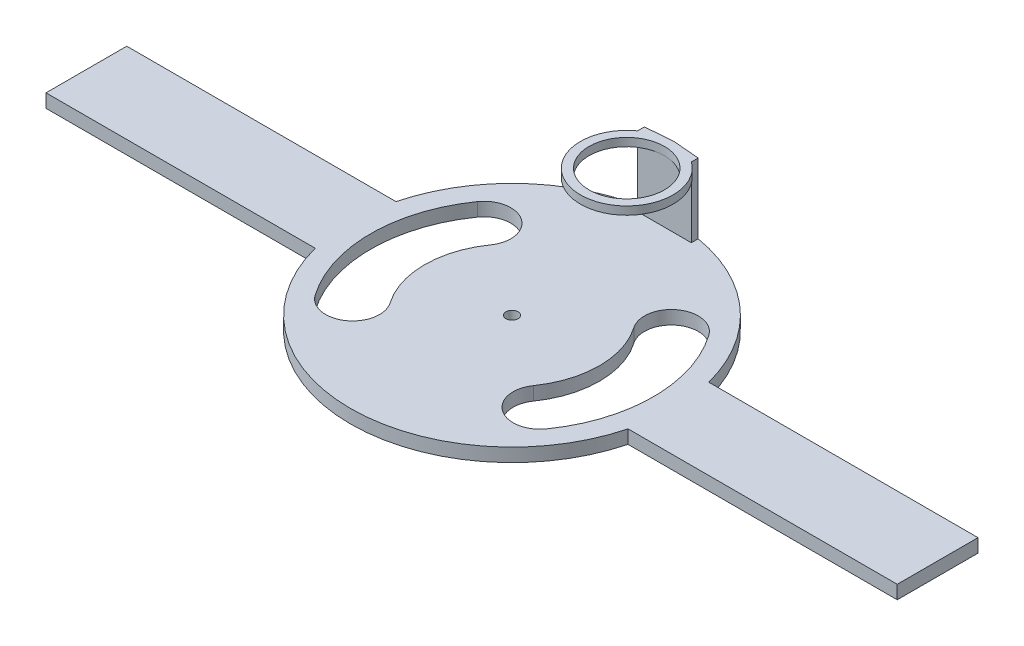
ISO-10303-21;
HEADER;
FILE_DESCRIPTION(('STEP AP214'),'2;1');
FILE_NAME('part.step','',(''),(''),'','','');
FILE_SCHEMA(('AUTOMOTIVE_DESIGN { 1 0 10303 214 1 1 1 1 }'));
ENDSEC;
DATA;
#1=APPLICATION_CONTEXT('core data for automotive mechanical design processes');
#2=APPLICATION_PROTOCOL_DEFINITION('international standard','automotive_design',2000,#1);
#3=PRODUCT_CONTEXT('',#1,'mechanical');
#4=PRODUCT('Part','Part','',(#3));
#5=PRODUCT_RELATED_PRODUCT_CATEGORY('part','',(#4));
#6=PRODUCT_DEFINITION_FORMATION('','',#4);
#7=PRODUCT_DEFINITION_CONTEXT('part definition',#1,'design');
#8=PRODUCT_DEFINITION('design','',#6,#7);
#9=PRODUCT_DEFINITION_SHAPE('','',#8);
#10=(LENGTH_UNIT() NAMED_UNIT(*) SI_UNIT(.MILLI.,.METRE.));
#11=(NAMED_UNIT(*) PLANE_ANGLE_UNIT() SI_UNIT($,.RADIAN.));
#12=(NAMED_UNIT(*) SI_UNIT($,.STERADIAN.) SOLID_ANGLE_UNIT());
#13=UNCERTAINTY_MEASURE_WITH_UNIT(LENGTH_MEASURE(1.E-05),#10,'distance_accuracy_value','');
#14=(GEOMETRIC_REPRESENTATION_CONTEXT(3) GLOBAL_UNCERTAINTY_ASSIGNED_CONTEXT((#13)) GLOBAL_UNIT_ASSIGNED_CONTEXT((#10,
#11,#12)) REPRESENTATION_CONTEXT('',''));
#15=CARTESIAN_POINT('',(0.,0.,0.));
#16=DIRECTION('',(0.,0.,1.));
#17=DIRECTION('',(1.,0.,0.));
#18=AXIS2_PLACEMENT_3D('',#15,#16,#17);
#19=CARTESIAN_POINT('',(0.,28.,0.));
#20=DIRECTION('',(0.,1.,0.));
#21=DIRECTION('',(0.,0.,1.));
#22=AXIS2_PLACEMENT_3D('',#19,#20,#21);
#23=PLANE('',#22);
#24=CARTESIAN_POINT('',(0.,28.,0.));
#25=DIRECTION('',(0.,1.,0.));
#26=DIRECTION('',(0.,0.,1.));
#27=AXIS2_PLACEMENT_3D('',#24,#25,#26);
#28=CIRCLE('',#27,60.);
#29=CARTESIAN_POINT('',(-1.15359111152458E-13,28.,-60.));
#30=VERTEX_POINT('',#29);
#31=CARTESIAN_POINT('',(-10.,28.,-59.1607978309962));
#32=VERTEX_POINT('',#31);
#33=EDGE_CURVE('E291',#30,#32,#28,.T.);
#34=ORIENTED_EDGE('',*,*,#33,.T.);
#35=DIRECTION('',(0.99649718945496,0.,-0.0836262602796829));
#36=VECTOR('',#35,1.);
#37=CARTESIAN_POINT('',(-4.99999999999998,28.,-59.5803989154981));
#38=LINE('',#37,#36);
#39=EDGE_CURVE('E409',#32,#30,#38,.T.);
#40=ORIENTED_EDGE('',*,*,#39,.T.);
#41=EDGE_LOOP('',(#34,#40));
#42=FACE_BOUND('',#41,.T.);
#43=ADVANCED_FACE('F45',(#42),#23,.T.);
#44=CARTESIAN_POINT('',(10.,28.,-59.1607978309962));
#45=VERTEX_POINT('',#44);
#46=EDGE_CURVE('E293',#45,#30,#28,.T.);
#47=ORIENTED_EDGE('',*,*,#46,.T.);
#48=DIRECTION('',(0.99649718945496,0.,0.0836262602796836));
#49=VECTOR('',#48,1.);
#50=CARTESIAN_POINT('',(5.00000000000002,28.,-59.5803989154981));
#51=LINE('',#50,#49);
#52=EDGE_CURVE('E414',#30,#45,#51,.T.);
#53=ORIENTED_EDGE('',*,*,#52,.T.);
#54=EDGE_LOOP('',(#47,#53));
#55=FACE_BOUND('',#54,.T.);
#56=ADVANCED_FACE('F419',(#55),#23,.T.);
#57=CARTESIAN_POINT('',(0.,5.,0.));
#58=DIRECTION('',(0.,-1.,0.));
#59=DIRECTION('',(0.,0.,-1.));
#60=AXIS2_PLACEMENT_3D('',#57,#58,#59);
#61=CYLINDRICAL_SURFACE('',#60,60.);
#62=DIRECTION('',(0.,1.,0.));
#63=VECTOR('',#62,1.);
#64=CARTESIAN_POINT('',(58.0947501931113,0.,-15.));
#65=LINE('',#64,#63);
#66=CARTESIAN_POINT('',(58.0947501931113,0.,-15.));
#67=VERTEX_POINT('',#66);
#68=CARTESIAN_POINT('',(58.0947501931113,5.,-15.));
#69=VERTEX_POINT('',#68);
#70=EDGE_CURVE('E63',#67,#69,#65,.T.);
#71=ORIENTED_EDGE('',*,*,#70,.F.);
#72=CARTESIAN_POINT('',(0.,0.,0.));
#73=DIRECTION('',(0.,1.,0.));
#74=DIRECTION('',(0.,0.,1.));
#75=AXIS2_PLACEMENT_3D('',#72,#73,#74);
#76=CIRCLE('',#75,60.);
#77=CARTESIAN_POINT('',(-58.0947501931113,0.,-15.));
#78=VERTEX_POINT('',#77);
#79=EDGE_CURVE('E342',#67,#78,#76,.T.);
#80=ORIENTED_EDGE('',*,*,#79,.T.);
#81=DIRECTION('',(0.,1.,0.));
#82=VECTOR('',#81,1.);
#83=CARTESIAN_POINT('',(-58.0947501931113,0.,-15.));
#84=LINE('',#83,#82);
#85=CARTESIAN_POINT('',(-58.0947501931113,5.,-15.));
#86=VERTEX_POINT('',#85);
#87=EDGE_CURVE('E272',#78,#86,#84,.T.);
#88=ORIENTED_EDGE('',*,*,#87,.T.);
#89=CARTESIAN_POINT('',(0.,5.,0.));
#90=DIRECTION('',(0.,1.,0.));
#91=DIRECTION('',(0.,0.,1.));
#92=AXIS2_PLACEMENT_3D('',#89,#90,#91);
#93=CIRCLE('',#92,60.);
#94=CARTESIAN_POINT('',(-10.,5.,-59.1607978309962));
#95=VERTEX_POINT('',#94);
#96=EDGE_CURVE('E11',#95,#86,#93,.T.);
#97=ORIENTED_EDGE('',*,*,#96,.F.);
#98=DIRECTION('',(0.,-1.,0.));
#99=VECTOR('',#98,1.);
#100=CARTESIAN_POINT('',(-10.,28.,-59.1607978309962));
#101=LINE('',#100,#99);
#102=EDGE_CURVE('E305',#32,#95,#101,.T.);
#103=ORIENTED_EDGE('',*,*,#102,.F.);
#104=ORIENTED_EDGE('',*,*,#33,.F.);
#105=ORIENTED_EDGE('',*,*,#46,.F.);
#106=DIRECTION('',(0.,-1.,0.));
#107=VECTOR('',#106,1.);
#108=CARTESIAN_POINT('',(10.,28.,-59.1607978309962));
#109=LINE('',#108,#107);
#110=CARTESIAN_POINT('',(10.,5.,-59.1607978309962));
#111=VERTEX_POINT('',#110);
#112=EDGE_CURVE('E308',#45,#111,#109,.T.);
#113=ORIENTED_EDGE('',*,*,#112,.T.);
#114=EDGE_CURVE('E56',#69,#111,#93,.T.);
#115=ORIENTED_EDGE('',*,*,#114,.F.);
#116=EDGE_LOOP('',(#71,#80,#88,#97,#103,#104,#105,#113,#115));
#117=FACE_BOUND('',#116,.T.);
#118=ADVANCED_FACE('F47',(#117),#61,.T.);
#119=DIRECTION('',(0.,1.,0.));
#120=VECTOR('',#119,1.);
#121=CARTESIAN_POINT('',(58.0947501931112,0.,15.));
#122=LINE('',#121,#120);
#123=CARTESIAN_POINT('',(58.0947501931112,0.,15.));
#124=VERTEX_POINT('',#123);
#125=CARTESIAN_POINT('',(58.0947501931112,5.,15.));
#126=VERTEX_POINT('',#125);
#127=EDGE_CURVE('E250',#124,#126,#122,.T.);
#128=ORIENTED_EDGE('',*,*,#127,.T.);
#129=CARTESIAN_POINT('',(-58.0947501931113,5.,15.));
#130=VERTEX_POINT('',#129);
#131=EDGE_CURVE('E54',#130,#126,#93,.T.);
#132=ORIENTED_EDGE('',*,*,#131,.F.);
#133=DIRECTION('',(0.,1.,0.));
#134=VECTOR('',#133,1.);
#135=CARTESIAN_POINT('',(-58.0947501931112,0.,15.));
#136=LINE('',#135,#134);
#137=CARTESIAN_POINT('',(-58.0947501931112,0.,15.));
#138=VERTEX_POINT('',#137);
#139=EDGE_CURVE('E278',#138,#130,#136,.T.);
#140=ORIENTED_EDGE('',*,*,#139,.F.);
#141=EDGE_CURVE('E378',#138,#124,#76,.T.);
#142=ORIENTED_EDGE('',*,*,#141,.T.);
#143=EDGE_LOOP('',(#128,#132,#140,#142));
#144=FACE_BOUND('',#143,.T.);
#145=ADVANCED_FACE('F441',(#144),#61,.T.);
#146=CARTESIAN_POINT('',(0.,5.,0.));
#147=DIRECTION('',(0.,1.,0.));
#148=DIRECTION('',(0.,0.,1.));
#149=AXIS2_PLACEMENT_3D('',#146,#147,#148);
#150=PLANE('',#149);
#151=CARTESIAN_POINT('',(0.,5.,0.));
#152=DIRECTION('',(0.,1.,0.));
#153=DIRECTION('',(0.,0.,1.));
#154=AXIS2_PLACEMENT_3D('',#151,#152,#153);
#155=CIRCLE('',#154,2.25);
#156=CARTESIAN_POINT('',(0.,5.,2.25));
#157=VERTEX_POINT('',#156);
#158=EDGE_CURVE('E280',#157,#157,#155,.T.);
#159=ORIENTED_EDGE('',*,*,#158,.F.);
#160=EDGE_LOOP('',(#159));
#161=FACE_BOUND('',#160,.T.);
#162=DIRECTION('',(0.,0.,1.));
#163=VECTOR('',#162,1.);
#164=CARTESIAN_POINT('',(-10.,5.,-56.6237582645306));
#165=LINE('',#164,#163);
#166=CARTESIAN_POINT('',(-10.,5.,-56.6237582645306));
#167=VERTEX_POINT('',#166);
#168=EDGE_CURVE('E302',#95,#167,#165,.T.);
#169=ORIENTED_EDGE('',*,*,#168,.F.);
#170=ORIENTED_EDGE('',*,*,#96,.T.);
#171=DIRECTION('',(-1.,0.,0.));
#172=VECTOR('',#171,1.);
#173=CARTESIAN_POINT('',(-58.0947501931113,5.,-15.));
#174=LINE('',#173,#172);
#175=CARTESIAN_POINT('',(-158.094750193111,5.,-15.));
#176=VERTEX_POINT('',#175);
#177=EDGE_CURVE('E255',#86,#176,#174,.T.);
#178=ORIENTED_EDGE('',*,*,#177,.T.);
#179=DIRECTION('',(0.,0.,1.));
#180=VECTOR('',#179,1.);
#181=CARTESIAN_POINT('',(-158.094750193111,5.,-15.));
#182=LINE('',#181,#180);
#183=CARTESIAN_POINT('',(-158.094750193111,5.,15.));
#184=VERTEX_POINT('',#183);
#185=EDGE_CURVE('E275',#176,#184,#182,.T.);
#186=ORIENTED_EDGE('',*,*,#185,.T.);
#187=DIRECTION('',(1.,0.,0.));
#188=VECTOR('',#187,1.);
#189=CARTESIAN_POINT('',(-58.0947501931112,5.,15.));
#190=LINE('',#189,#188);
#191=EDGE_CURVE('E71',#184,#130,#190,.T.);
#192=ORIENTED_EDGE('',*,*,#191,.T.);
#193=ORIENTED_EDGE('',*,*,#131,.T.);
#194=DIRECTION('',(-1.,0.,0.));
#195=VECTOR('',#194,1.);
#196=CARTESIAN_POINT('',(58.0947501931112,5.,15.));
#197=LINE('',#196,#195);
#198=CARTESIAN_POINT('',(158.094750193111,5.,15.));
#199=VERTEX_POINT('',#198);
#200=EDGE_CURVE('E236',#199,#126,#197,.T.);
#201=ORIENTED_EDGE('',*,*,#200,.F.);
#202=DIRECTION('',(0.,0.,1.));
#203=VECTOR('',#202,1.);
#204=CARTESIAN_POINT('',(158.094750193111,5.,-15.));
#205=LINE('',#204,#203);
#206=CARTESIAN_POINT('',(158.094750193111,5.,-15.));
#207=VERTEX_POINT('',#206);
#208=EDGE_CURVE('E238',#207,#199,#205,.T.);
#209=ORIENTED_EDGE('',*,*,#208,.F.);
#210=DIRECTION('',(1.,0.,0.));
#211=VECTOR('',#210,1.);
#212=CARTESIAN_POINT('',(58.0947501931113,5.,-15.));
#213=LINE('',#212,#211);
#214=EDGE_CURVE('E247',#69,#207,#213,.T.);
#215=ORIENTED_EDGE('',*,*,#214,.F.);
#216=ORIENTED_EDGE('',*,*,#114,.T.);
#217=DIRECTION('',(0.,0.,-1.));
#218=VECTOR('',#217,1.);
#219=CARTESIAN_POINT('',(10.,5.,-56.6237582645306));
#220=LINE('',#219,#218);
#221=CARTESIAN_POINT('',(10.,5.,-56.6237582645306));
#222=VERTEX_POINT('',#221);
#223=EDGE_CURVE('E299',#222,#111,#220,.T.);
#224=ORIENTED_EDGE('',*,*,#223,.F.);
#225=DIRECTION('',(1.,0.,0.));
#226=VECTOR('',#225,1.);
#227=CARTESIAN_POINT('',(-10.,5.,-56.6237582645306));
#228=LINE('',#227,#226);
#229=EDGE_CURVE('E296',#167,#222,#228,.T.);
#230=ORIENTED_EDGE('',*,*,#229,.F.);
#231=EDGE_LOOP('',(#169,#170,#178,#186,#192,#193,#201,#209,#215,#216,#224,#230));
#232=FACE_BOUND('',#231,.T.);
#233=CARTESIAN_POINT('',(-34.8139618822823,5.,24.3769985449193));
#234=DIRECTION('',(0.,1.,0.));
#235=DIRECTION('',(0.,0.,1.));
#236=AXIS2_PLACEMENT_3D('',#233,#234,#235);
#237=CIRCLE('',#236,10.);
#238=CARTESIAN_POINT('',(-43.0054823251722,5.,30.1127629084297));
#239=VERTEX_POINT('',#238);
#240=CARTESIAN_POINT('',(-26.6224414393923,5.,18.6412341814089));
#241=VERTEX_POINT('',#240);
#242=EDGE_CURVE('E332',#239,#241,#237,.T.);
#243=ORIENTED_EDGE('',*,*,#242,.F.);
#244=CARTESIAN_POINT('',(0.,5.,0.));
#245=DIRECTION('',(0.,1.,0.));
#246=DIRECTION('',(0.,0.,1.));
#247=AXIS2_PLACEMENT_3D('',#244,#245,#246);
#248=CIRCLE('',#247,52.5);
#249=CARTESIAN_POINT('',(-43.0054823251722,5.,-30.1127629084297));
#250=VERTEX_POINT('',#249);
#251=EDGE_CURVE('E358',#250,#239,#248,.T.);
#252=ORIENTED_EDGE('',*,*,#251,.F.);
#253=CARTESIAN_POINT('',(-34.8139618822823,5.,-24.3769985449193));
#254=DIRECTION('',(0.,1.,0.));
#255=DIRECTION('',(0.,0.,1.));
#256=AXIS2_PLACEMENT_3D('',#253,#254,#255);
#257=CIRCLE('',#256,10.);
#258=CARTESIAN_POINT('',(-26.6224414393923,5.,-18.6412341814088));
#259=VERTEX_POINT('',#258);
#260=EDGE_CURVE('E361',#259,#250,#257,.T.);
#261=ORIENTED_EDGE('',*,*,#260,.F.);
#262=CARTESIAN_POINT('',(0.,5.,0.));
#263=DIRECTION('',(0.,-1.,0.));
#264=DIRECTION('',(0.,0.,1.));
#265=AXIS2_PLACEMENT_3D('',#262,#263,#264);
#266=CIRCLE('',#265,32.5);
#267=EDGE_CURVE('E365',#241,#259,#266,.T.);
#268=ORIENTED_EDGE('',*,*,#267,.F.);
#269=EDGE_LOOP('',(#243,#252,#261,#268));
#270=FACE_BOUND('',#269,.T.);
#271=CARTESIAN_POINT('',(0.,5.,0.));
#272=DIRECTION('',(0.,-1.,0.));
#273=DIRECTION('',(0.,0.,1.));
#274=AXIS2_PLACEMENT_3D('',#271,#272,#273);
#275=CIRCLE('',#274,32.5);
#276=CARTESIAN_POINT('',(26.6224414393922,5.,-18.641234181409));
#277=VERTEX_POINT('',#276);
#278=CARTESIAN_POINT('',(26.6224414393922,5.,18.641234181409));
#279=VERTEX_POINT('',#278);
#280=EDGE_CURVE('E329',#277,#279,#275,.T.);
#281=ORIENTED_EDGE('',*,*,#280,.F.);
#282=CARTESIAN_POINT('',(34.8139618822821,5.,-24.3769985449195));
#283=DIRECTION('',(0.,1.,0.));
#284=DIRECTION('',(0.,0.,1.));
#285=AXIS2_PLACEMENT_3D('',#282,#283,#284);
#286=CIRCLE('',#285,10.);
#287=CARTESIAN_POINT('',(43.005482325172,5.,-30.11276290843));
#288=VERTEX_POINT('',#287);
#289=EDGE_CURVE('E319',#288,#277,#286,.T.);
#290=ORIENTED_EDGE('',*,*,#289,.F.);
#291=CARTESIAN_POINT('',(0.,5.,0.));
#292=DIRECTION('',(0.,1.,0.));
#293=DIRECTION('',(0.,0.,1.));
#294=AXIS2_PLACEMENT_3D('',#291,#292,#293);
#295=CIRCLE('',#294,52.5);
#296=CARTESIAN_POINT('',(43.005482325172,5.,30.11276290843));
#297=VERTEX_POINT('',#296);
#298=EDGE_CURVE('E335',#297,#288,#295,.T.);
#299=ORIENTED_EDGE('',*,*,#298,.F.);
#300=CARTESIAN_POINT('',(34.8139618822821,5.,24.3769985449195));
#301=DIRECTION('',(0.,1.,0.));
#302=DIRECTION('',(0.,0.,1.));
#303=AXIS2_PLACEMENT_3D('',#300,#301,#302);
#304=CIRCLE('',#303,10.);
#305=EDGE_CURVE('E331',#279,#297,#304,.T.);
#306=ORIENTED_EDGE('',*,*,#305,.F.);
#307=EDGE_LOOP('',(#281,#290,#299,#306));
#308=FACE_BOUND('',#307,.T.);
#309=ADVANCED_FACE('F399',(#161,#232,#270,#308),#150,.T.);
#310=CARTESIAN_POINT('',(0.,0.,0.));
#311=DIRECTION('',(0.,1.,0.));
#312=DIRECTION('',(0.,0.,1.));
#313=AXIS2_PLACEMENT_3D('',#310,#311,#312);
#314=PLANE('',#313);
#315=CARTESIAN_POINT('',(0.,0.,0.));
#316=DIRECTION('',(0.,1.,0.));
#317=DIRECTION('',(0.,0.,1.));
#318=AXIS2_PLACEMENT_3D('',#315,#316,#317);
#319=CIRCLE('',#318,2.25);
#320=CARTESIAN_POINT('',(0.,0.,2.25));
#321=VERTEX_POINT('',#320);
#322=EDGE_CURVE('E49',#321,#321,#319,.T.);
#323=ORIENTED_EDGE('',*,*,#322,.T.);
#324=EDGE_LOOP('',(#323));
#325=FACE_BOUND('',#324,.T.);
#326=ORIENTED_EDGE('',*,*,#141,.F.);
#327=DIRECTION('',(1.,0.,0.));
#328=VECTOR('',#327,1.);
#329=CARTESIAN_POINT('',(-58.0947501931112,0.,15.));
#330=LINE('',#329,#328);
#331=CARTESIAN_POINT('',(-158.094750193111,0.,15.));
#332=VERTEX_POINT('',#331);
#333=EDGE_CURVE('E270',#332,#138,#330,.T.);
#334=ORIENTED_EDGE('',*,*,#333,.F.);
#335=DIRECTION('',(0.,0.,1.));
#336=VECTOR('',#335,1.);
#337=CARTESIAN_POINT('',(-158.094750193111,0.,-15.));
#338=LINE('',#337,#336);
#339=CARTESIAN_POINT('',(-158.094750193111,0.,-15.));
#340=VERTEX_POINT('',#339);
#341=EDGE_CURVE('E267',#340,#332,#338,.T.);
#342=ORIENTED_EDGE('',*,*,#341,.F.);
#343=DIRECTION('',(-1.,0.,0.));
#344=VECTOR('',#343,1.);
#345=CARTESIAN_POINT('',(-58.0947501931113,0.,-15.));
#346=LINE('',#345,#344);
#347=EDGE_CURVE('E264',#78,#340,#346,.T.);
#348=ORIENTED_EDGE('',*,*,#347,.F.);
#349=ORIENTED_EDGE('',*,*,#79,.F.);
#350=DIRECTION('',(1.,0.,0.));
#351=VECTOR('',#350,1.);
#352=CARTESIAN_POINT('',(58.0947501931113,0.,-15.));
#353=LINE('',#352,#351);
#354=CARTESIAN_POINT('',(158.094750193111,0.,-15.));
#355=VERTEX_POINT('',#354);
#356=EDGE_CURVE('E249',#67,#355,#353,.T.);
#357=ORIENTED_EDGE('',*,*,#356,.T.);
#358=DIRECTION('',(0.,0.,1.));
#359=VECTOR('',#358,1.);
#360=CARTESIAN_POINT('',(158.094750193111,0.,-15.));
#361=LINE('',#360,#359);
#362=CARTESIAN_POINT('',(158.094750193111,0.,15.));
#363=VERTEX_POINT('',#362);
#364=EDGE_CURVE('E246',#355,#363,#361,.T.);
#365=ORIENTED_EDGE('',*,*,#364,.T.);
#366=DIRECTION('',(-1.,0.,0.));
#367=VECTOR('',#366,1.);
#368=CARTESIAN_POINT('',(58.0947501931112,0.,15.));
#369=LINE('',#368,#367);
#370=EDGE_CURVE('E244',#363,#124,#369,.T.);
#371=ORIENTED_EDGE('',*,*,#370,.T.);
#372=EDGE_LOOP('',(#326,#334,#342,#348,#349,#357,#365,#371));
#373=FACE_BOUND('',#372,.T.);
#374=CARTESIAN_POINT('',(0.,0.,0.));
#375=DIRECTION('',(0.,1.,0.));
#376=DIRECTION('',(0.,0.,1.));
#377=AXIS2_PLACEMENT_3D('',#374,#375,#376);
#378=CIRCLE('',#377,52.5);
#379=CARTESIAN_POINT('',(-43.0054823251722,0.,-30.1127629084297));
#380=VERTEX_POINT('',#379);
#381=CARTESIAN_POINT('',(-43.0054823251722,0.,30.1127629084297));
#382=VERTEX_POINT('',#381);
#383=EDGE_CURVE('E352',#380,#382,#378,.T.);
#384=ORIENTED_EDGE('',*,*,#383,.T.);
#385=CARTESIAN_POINT('',(-34.8139618822823,0.,24.3769985449193));
#386=DIRECTION('',(0.,1.,0.));
#387=DIRECTION('',(0.,0.,1.));
#388=AXIS2_PLACEMENT_3D('',#385,#386,#387);
#389=CIRCLE('',#388,10.);
#390=CARTESIAN_POINT('',(-26.6224414393923,0.,18.6412341814089));
#391=VERTEX_POINT('',#390);
#392=EDGE_CURVE('E362',#382,#391,#389,.T.);
#393=ORIENTED_EDGE('',*,*,#392,.T.);
#394=CARTESIAN_POINT('',(0.,0.,0.));
#395=DIRECTION('',(0.,-1.,0.));
#396=DIRECTION('',(0.,0.,1.));
#397=AXIS2_PLACEMENT_3D('',#394,#395,#396);
#398=CIRCLE('',#397,32.5);
#399=CARTESIAN_POINT('',(-26.6224414393923,0.,-18.6412341814088));
#400=VERTEX_POINT('',#399);
#401=EDGE_CURVE('E374',#391,#400,#398,.T.);
#402=ORIENTED_EDGE('',*,*,#401,.T.);
#403=CARTESIAN_POINT('',(-34.8139618822823,0.,-24.3769985449193));
#404=DIRECTION('',(0.,1.,0.));
#405=DIRECTION('',(0.,0.,1.));
#406=AXIS2_PLACEMENT_3D('',#403,#404,#405);
#407=CIRCLE('',#406,10.);
#408=EDGE_CURVE('E371',#400,#380,#407,.T.);
#409=ORIENTED_EDGE('',*,*,#408,.T.);
#410=EDGE_LOOP('',(#384,#393,#402,#409));
#411=FACE_BOUND('',#410,.T.);
#412=CARTESIAN_POINT('',(34.8139618822821,0.,-24.3769985449195));
#413=DIRECTION('',(0.,1.,0.));
#414=DIRECTION('',(0.,0.,1.));
#415=AXIS2_PLACEMENT_3D('',#412,#413,#414);
#416=CIRCLE('',#415,10.);
#417=CARTESIAN_POINT('',(43.005482325172,0.,-30.11276290843));
#418=VERTEX_POINT('',#417);
#419=CARTESIAN_POINT('',(26.6224414393922,0.,-18.641234181409));
#420=VERTEX_POINT('',#419);
#421=EDGE_CURVE('E325',#418,#420,#416,.T.);
#422=ORIENTED_EDGE('',*,*,#421,.T.);
#423=CARTESIAN_POINT('',(0.,0.,0.));
#424=DIRECTION('',(0.,-1.,0.));
#425=DIRECTION('',(0.,0.,1.));
#426=AXIS2_PLACEMENT_3D('',#423,#424,#425);
#427=CIRCLE('',#426,32.5);
#428=CARTESIAN_POINT('',(26.6224414393922,0.,18.641234181409));
#429=VERTEX_POINT('',#428);
#430=EDGE_CURVE('E315',#420,#429,#427,.T.);
#431=ORIENTED_EDGE('',*,*,#430,.T.);
#432=CARTESIAN_POINT('',(34.8139618822821,0.,24.3769985449195));
#433=DIRECTION('',(0.,1.,0.));
#434=DIRECTION('',(0.,0.,1.));
#435=AXIS2_PLACEMENT_3D('',#432,#433,#434);
#436=CIRCLE('',#435,10.);
#437=CARTESIAN_POINT('',(43.005482325172,0.,30.11276290843));
#438=VERTEX_POINT('',#437);
#439=EDGE_CURVE('E318',#429,#438,#436,.T.);
#440=ORIENTED_EDGE('',*,*,#439,.T.);
#441=CARTESIAN_POINT('',(0.,0.,0.));
#442=DIRECTION('',(0.,1.,0.));
#443=DIRECTION('',(0.,0.,1.));
#444=AXIS2_PLACEMENT_3D('',#441,#442,#443);
#445=CIRCLE('',#444,52.5);
#446=EDGE_CURVE('E322',#438,#418,#445,.T.);
#447=ORIENTED_EDGE('',*,*,#446,.T.);
#448=EDGE_LOOP('',(#422,#431,#440,#447));
#449=FACE_BOUND('',#448,.T.);
#450=ADVANCED_FACE('F393',(#325,#373,#411,#449),#314,.F.);
#451=CARTESIAN_POINT('',(-34.8139618822823,0.,24.3769985449193));
#452=DIRECTION('',(0.,1.,0.));
#453=DIRECTION('',(0.,0.,1.));
#454=AXIS2_PLACEMENT_3D('',#451,#452,#453);
#455=CYLINDRICAL_SURFACE('',#454,10.);
#456=ORIENTED_EDGE('',*,*,#242,.T.);
#457=DIRECTION('',(0.,1.,0.));
#458=VECTOR('',#457,1.);
#459=CARTESIAN_POINT('',(-26.6224414393923,0.,18.6412341814089));
#460=LINE('',#459,#458);
#461=EDGE_CURVE('E349',#391,#241,#460,.T.);
#462=ORIENTED_EDGE('',*,*,#461,.F.);
#463=ORIENTED_EDGE('',*,*,#392,.F.);
#464=DIRECTION('',(0.,1.,0.));
#465=VECTOR('',#464,1.);
#466=CARTESIAN_POINT('',(-43.0054823251722,0.,30.1127629084297));
#467=LINE('',#466,#465);
#468=EDGE_CURVE('E314',#382,#239,#467,.T.);
#469=ORIENTED_EDGE('',*,*,#468,.T.);
#470=EDGE_LOOP('',(#456,#462,#463,#469));
#471=FACE_BOUND('',#470,.T.);
#472=ADVANCED_FACE('F487',(#471),#455,.F.);
#473=CARTESIAN_POINT('',(0.,0.,0.));
#474=DIRECTION('',(0.,1.,0.));
#475=DIRECTION('',(0.,0.,1.));
#476=AXIS2_PLACEMENT_3D('',#473,#474,#475);
#477=CYLINDRICAL_SURFACE('',#476,52.5);
#478=ORIENTED_EDGE('',*,*,#251,.T.);
#479=ORIENTED_EDGE('',*,*,#468,.F.);
#480=ORIENTED_EDGE('',*,*,#383,.F.);
#481=DIRECTION('',(0.,1.,0.));
#482=VECTOR('',#481,1.);
#483=CARTESIAN_POINT('',(-43.0054823251722,0.,-30.1127629084297));
#484=LINE('',#483,#482);
#485=EDGE_CURVE('E355',#380,#250,#484,.T.);
#486=ORIENTED_EDGE('',*,*,#485,.T.);
#487=EDGE_LOOP('',(#478,#479,#480,#486));
#488=FACE_BOUND('',#487,.T.);
#489=ADVANCED_FACE('F490',(#488),#477,.F.);
#490=CARTESIAN_POINT('',(-34.8139618822823,0.,-24.3769985449193));
#491=DIRECTION('',(0.,1.,0.));
#492=DIRECTION('',(0.,0.,1.));
#493=AXIS2_PLACEMENT_3D('',#490,#491,#492);
#494=CYLINDRICAL_SURFACE('',#493,10.);
#495=ORIENTED_EDGE('',*,*,#260,.T.);
#496=ORIENTED_EDGE('',*,*,#485,.F.);
#497=ORIENTED_EDGE('',*,*,#408,.F.);
#498=DIRECTION('',(0.,1.,0.));
#499=VECTOR('',#498,1.);
#500=CARTESIAN_POINT('',(-26.6224414393923,0.,-18.6412341814088));
#501=LINE('',#500,#499);
#502=EDGE_CURVE('E353',#400,#259,#501,.T.);
#503=ORIENTED_EDGE('',*,*,#502,.T.);
#504=EDGE_LOOP('',(#495,#496,#497,#503));
#505=FACE_BOUND('',#504,.T.);
#506=ADVANCED_FACE('F494',(#505),#494,.F.);
#507=CARTESIAN_POINT('',(0.,0.,0.));
#508=DIRECTION('',(0.,1.,0.));
#509=DIRECTION('',(0.,0.,1.));
#510=AXIS2_PLACEMENT_3D('',#507,#508,#509);
#511=CYLINDRICAL_SURFACE('',#510,32.5);
#512=ORIENTED_EDGE('',*,*,#267,.T.);
#513=ORIENTED_EDGE('',*,*,#502,.F.);
#514=ORIENTED_EDGE('',*,*,#401,.F.);
#515=ORIENTED_EDGE('',*,*,#461,.T.);
#516=EDGE_LOOP('',(#512,#513,#514,#515));
#517=FACE_BOUND('',#516,.T.);
#518=ADVANCED_FACE('F485',(#517),#511,.T.);
#519=CARTESIAN_POINT('',(0.,0.,0.));
#520=DIRECTION('',(0.,1.,0.));
#521=DIRECTION('',(0.,0.,1.));
#522=AXIS2_PLACEMENT_3D('',#519,#520,#521);
#523=CYLINDRICAL_SURFACE('',#522,32.5);
#524=ORIENTED_EDGE('',*,*,#280,.T.);
#525=DIRECTION('',(0.,1.,0.));
#526=VECTOR('',#525,1.);
#527=CARTESIAN_POINT('',(26.6224414393922,0.,18.641234181409));
#528=LINE('',#527,#526);
#529=EDGE_CURVE('E328',#429,#279,#528,.T.);
#530=ORIENTED_EDGE('',*,*,#529,.F.);
#531=ORIENTED_EDGE('',*,*,#430,.F.);
#532=DIRECTION('',(0.,1.,0.));
#533=VECTOR('',#532,1.);
#534=CARTESIAN_POINT('',(26.6224414393922,0.,-18.641234181409));
#535=LINE('',#534,#533);
#536=EDGE_CURVE('E340',#420,#277,#535,.T.);
#537=ORIENTED_EDGE('',*,*,#536,.T.);
#538=EDGE_LOOP('',(#524,#530,#531,#537));
#539=FACE_BOUND('',#538,.T.);
#540=ADVANCED_FACE('F475',(#539),#523,.T.);
#541=CARTESIAN_POINT('',(34.8139618822821,0.,-24.3769985449195));
#542=DIRECTION('',(0.,1.,0.));
#543=DIRECTION('',(0.,0.,1.));
#544=AXIS2_PLACEMENT_3D('',#541,#542,#543);
#545=CYLINDRICAL_SURFACE('',#544,10.);
#546=ORIENTED_EDGE('',*,*,#289,.T.);
#547=ORIENTED_EDGE('',*,*,#536,.F.);
#548=ORIENTED_EDGE('',*,*,#421,.F.);
#549=DIRECTION('',(0.,1.,0.));
#550=VECTOR('',#549,1.);
#551=CARTESIAN_POINT('',(43.005482325172,0.,-30.11276290843));
#552=LINE('',#551,#550);
#553=EDGE_CURVE('E343',#418,#288,#552,.T.);
#554=ORIENTED_EDGE('',*,*,#553,.T.);
#555=EDGE_LOOP('',(#546,#547,#548,#554));
#556=FACE_BOUND('',#555,.T.);
#557=ADVANCED_FACE('F471',(#556),#545,.F.);
#558=CARTESIAN_POINT('',(0.,0.,0.));
#559=DIRECTION('',(0.,1.,0.));
#560=DIRECTION('',(0.,0.,1.));
#561=AXIS2_PLACEMENT_3D('',#558,#559,#560);
#562=CYLINDRICAL_SURFACE('',#561,52.5);
#563=ORIENTED_EDGE('',*,*,#298,.T.);
#564=ORIENTED_EDGE('',*,*,#553,.F.);
#565=ORIENTED_EDGE('',*,*,#446,.F.);
#566=DIRECTION('',(0.,1.,0.));
#567=VECTOR('',#566,1.);
#568=CARTESIAN_POINT('',(43.005482325172,0.,30.11276290843));
#569=LINE('',#568,#567);
#570=EDGE_CURVE('E345',#438,#297,#569,.T.);
#571=ORIENTED_EDGE('',*,*,#570,.T.);
#572=EDGE_LOOP('',(#563,#564,#565,#571));
#573=FACE_BOUND('',#572,.T.);
#574=ADVANCED_FACE('F474',(#573),#562,.F.);
#575=CARTESIAN_POINT('',(34.8139618822821,0.,24.3769985449195));
#576=DIRECTION('',(0.,1.,0.));
#577=DIRECTION('',(0.,0.,1.));
#578=AXIS2_PLACEMENT_3D('',#575,#576,#577);
#579=CYLINDRICAL_SURFACE('',#578,10.);
#580=ORIENTED_EDGE('',*,*,#305,.T.);
#581=ORIENTED_EDGE('',*,*,#570,.F.);
#582=ORIENTED_EDGE('',*,*,#439,.F.);
#583=ORIENTED_EDGE('',*,*,#529,.T.);
#584=EDGE_LOOP('',(#580,#581,#582,#583));
#585=FACE_BOUND('',#584,.T.);
#586=ADVANCED_FACE('F469',(#585),#579,.F.);
#587=CARTESIAN_POINT('',(-10.,28.,-56.6237582645306));
#588=DIRECTION('',(0.,0.,-1.));
#589=DIRECTION('',(-1.,0.,0.));
#590=AXIS2_PLACEMENT_3D('',#587,#588,#589);
#591=PLANE('',#590);
#592=ORIENTED_EDGE('',*,*,#229,.T.);
#593=DIRECTION('',(0.,-1.,0.));
#594=VECTOR('',#593,1.);
#595=CARTESIAN_POINT('',(10.,28.,-56.6237582645306));
#596=LINE('',#595,#594);
#597=CARTESIAN_POINT('',(10.,28.,-56.6237582645306));
#598=VERTEX_POINT('',#597);
#599=EDGE_CURVE('E311',#598,#222,#596,.T.);
#600=ORIENTED_EDGE('',*,*,#599,.F.);
#601=DIRECTION('',(1.,0.,0.));
#602=VECTOR('',#601,1.);
#603=CARTESIAN_POINT('',(-10.,28.,-56.6237582645306));
#604=LINE('',#603,#602);
#605=CARTESIAN_POINT('',(0.,28.,-56.6237582645306));
#606=VERTEX_POINT('',#605);
#607=EDGE_CURVE('E292',#606,#598,#604,.T.);
#608=ORIENTED_EDGE('',*,*,#607,.F.);
#609=CARTESIAN_POINT('',(-10.,28.,-56.6237582645306));
#610=VERTEX_POINT('',#609);
#611=EDGE_CURVE('E289',#610,#606,#604,.T.);
#612=ORIENTED_EDGE('',*,*,#611,.F.);
#613=DIRECTION('',(0.,-1.,0.));
#614=VECTOR('',#613,1.);
#615=CARTESIAN_POINT('',(-10.,28.,-56.6237582645306));
#616=LINE('',#615,#614);
#617=EDGE_CURVE('E234',#610,#167,#616,.T.);
#618=ORIENTED_EDGE('',*,*,#617,.T.);
#619=EDGE_LOOP('',(#592,#600,#608,#612,#618));
#620=FACE_BOUND('',#619,.T.);
#621=ADVANCED_FACE('F466',(#620),#591,.F.);
#622=CARTESIAN_POINT('',(10.,28.,-56.6237582645306));
#623=DIRECTION('',(-1.,0.,0.));
#624=DIRECTION('',(0.,0.,1.));
#625=AXIS2_PLACEMENT_3D('',#622,#623,#624);
#626=PLANE('',#625);
#627=ORIENTED_EDGE('',*,*,#223,.T.);
#628=ORIENTED_EDGE('',*,*,#112,.F.);
#629=DIRECTION('',(0.,-1.,0.));
#630=VECTOR('',#629,1.);
#631=CARTESIAN_POINT('',(10.,31.,-59.1607978309962));
#632=LINE('',#631,#630);
#633=CARTESIAN_POINT('',(10.,31.,-59.1607978309962));
#634=VERTEX_POINT('',#633);
#635=EDGE_CURVE('E240',#634,#45,#632,.T.);
#636=ORIENTED_EDGE('',*,*,#635,.F.);
#637=DIRECTION('',(0.,0.,-1.));
#638=VECTOR('',#637,1.);
#639=CARTESIAN_POINT('',(9.99999999999996,31.,0.));
#640=LINE('',#639,#638);
#641=CARTESIAN_POINT('',(10.,31.,-56.6237582645306));
#642=VERTEX_POINT('',#641);
#643=EDGE_CURVE('E219',#642,#634,#640,.T.);
#644=ORIENTED_EDGE('',*,*,#643,.F.);
#645=DIRECTION('',(0.,-1.,0.));
#646=VECTOR('',#645,1.);
#647=CARTESIAN_POINT('',(10.,31.,-56.6237582645306));
#648=LINE('',#647,#646);
#649=EDGE_CURVE('E216',#642,#598,#648,.T.);
#650=ORIENTED_EDGE('',*,*,#649,.T.);
#651=ORIENTED_EDGE('',*,*,#599,.T.);
#652=EDGE_LOOP('',(#627,#628,#636,#644,#650,#651));
#653=FACE_BOUND('',#652,.T.);
#654=ADVANCED_FACE('F426',(#653),#626,.F.);
#655=CARTESIAN_POINT('',(-10.,28.,-56.6237582645306));
#656=DIRECTION('',(1.,0.,0.));
#657=DIRECTION('',(0.,0.,-1.));
#658=AXIS2_PLACEMENT_3D('',#655,#656,#657);
#659=PLANE('',#658);
#660=ORIENTED_EDGE('',*,*,#168,.T.);
#661=ORIENTED_EDGE('',*,*,#617,.F.);
#662=DIRECTION('',(0.,-1.,0.));
#663=VECTOR('',#662,1.);
#664=CARTESIAN_POINT('',(-10.,31.,-56.6237582645306));
#665=LINE('',#664,#663);
#666=CARTESIAN_POINT('',(-10.,31.,-56.6237582645306));
#667=VERTEX_POINT('',#666);
#668=EDGE_CURVE('E213',#667,#610,#665,.T.);
#669=ORIENTED_EDGE('',*,*,#668,.F.);
#670=DIRECTION('',(0.,0.,1.));
#671=VECTOR('',#670,1.);
#672=CARTESIAN_POINT('',(-10.,31.,0.));
#673=LINE('',#672,#671);
#674=CARTESIAN_POINT('',(-10.,31.,-59.1607978309962));
#675=VERTEX_POINT('',#674);
#676=EDGE_CURVE('E220',#675,#667,#673,.T.);
#677=ORIENTED_EDGE('',*,*,#676,.F.);
#678=DIRECTION('',(0.,-1.,0.));
#679=VECTOR('',#678,1.);
#680=CARTESIAN_POINT('',(-10.,31.,-59.1607978309962));
#681=LINE('',#680,#679);
#682=EDGE_CURVE('E403',#675,#32,#681,.T.);
#683=ORIENTED_EDGE('',*,*,#682,.T.);
#684=ORIENTED_EDGE('',*,*,#102,.T.);
#685=EDGE_LOOP('',(#660,#661,#669,#677,#683,#684));
#686=FACE_BOUND('',#685,.T.);
#687=ADVANCED_FACE('F232',(#686),#659,.F.);
#688=CARTESIAN_POINT('',(0.,-10.,0.));
#689=DIRECTION('',(0.,1.,0.));
#690=DIRECTION('',(0.,0.,1.));
#691=AXIS2_PLACEMENT_3D('',#688,#689,#690);
#692=CYLINDRICAL_SURFACE('',#691,2.25);
#693=ORIENTED_EDGE('',*,*,#158,.T.);
#694=EDGE_LOOP('',(#693));
#695=FACE_BOUND('',#694,.T.);
#696=ORIENTED_EDGE('',*,*,#322,.F.);
#697=EDGE_LOOP('',(#696));
#698=FACE_BOUND('',#697,.T.);
#699=ADVANCED_FACE('F445',(#695,#698),#692,.F.);
#700=CARTESIAN_POINT('',(-58.0947501931112,0.,15.));
#701=DIRECTION('',(0.,0.,1.));
#702=DIRECTION('',(1.,0.,0.));
#703=AXIS2_PLACEMENT_3D('',#700,#701,#702);
#704=PLANE('',#703);
#705=ORIENTED_EDGE('',*,*,#191,.F.);
#706=DIRECTION('',(0.,1.,0.));
#707=VECTOR('',#706,1.);
#708=CARTESIAN_POINT('',(-158.094750193111,0.,15.));
#709=LINE('',#708,#707);
#710=EDGE_CURVE('E281',#332,#184,#709,.T.);
#711=ORIENTED_EDGE('',*,*,#710,.F.);
#712=ORIENTED_EDGE('',*,*,#333,.T.);
#713=ORIENTED_EDGE('',*,*,#139,.T.);
#714=EDGE_LOOP('',(#705,#711,#712,#713));
#715=FACE_BOUND('',#714,.T.);
#716=ADVANCED_FACE('F443',(#715),#704,.T.);
#717=CARTESIAN_POINT('',(-158.094750193111,0.,-15.));
#718=DIRECTION('',(-1.,0.,0.));
#719=DIRECTION('',(0.,0.,1.));
#720=AXIS2_PLACEMENT_3D('',#717,#718,#719);
#721=PLANE('',#720);
#722=ORIENTED_EDGE('',*,*,#185,.F.);
#723=DIRECTION('',(0.,1.,0.));
#724=VECTOR('',#723,1.);
#725=CARTESIAN_POINT('',(-158.094750193111,0.,-15.));
#726=LINE('',#725,#724);
#727=EDGE_CURVE('E283',#340,#176,#726,.T.);
#728=ORIENTED_EDGE('',*,*,#727,.F.);
#729=ORIENTED_EDGE('',*,*,#341,.T.);
#730=ORIENTED_EDGE('',*,*,#710,.T.);
#731=EDGE_LOOP('',(#722,#728,#729,#730));
#732=FACE_BOUND('',#731,.T.);
#733=ADVANCED_FACE('F398',(#732),#721,.T.);
#734=CARTESIAN_POINT('',(-58.0947501931113,0.,-15.));
#735=DIRECTION('',(0.,0.,-1.));
#736=DIRECTION('',(-1.,0.,0.));
#737=AXIS2_PLACEMENT_3D('',#734,#735,#736);
#738=PLANE('',#737);
#739=ORIENTED_EDGE('',*,*,#177,.F.);
#740=ORIENTED_EDGE('',*,*,#87,.F.);
#741=ORIENTED_EDGE('',*,*,#347,.T.);
#742=ORIENTED_EDGE('',*,*,#727,.T.);
#743=EDGE_LOOP('',(#739,#740,#741,#742));
#744=FACE_BOUND('',#743,.T.);
#745=ADVANCED_FACE('F391',(#744),#738,.T.);
#746=CARTESIAN_POINT('',(58.0947501931113,0.,-15.));
#747=DIRECTION('',(0.,0.,1.));
#748=DIRECTION('',(1.,0.,0.));
#749=AXIS2_PLACEMENT_3D('',#746,#747,#748);
#750=PLANE('',#749);
#751=ORIENTED_EDGE('',*,*,#214,.T.);
#752=DIRECTION('',(0.,1.,0.));
#753=VECTOR('',#752,1.);
#754=CARTESIAN_POINT('',(158.094750193111,0.,-15.));
#755=LINE('',#754,#753);
#756=EDGE_CURVE('E256',#355,#207,#755,.T.);
#757=ORIENTED_EDGE('',*,*,#756,.F.);
#758=ORIENTED_EDGE('',*,*,#356,.F.);
#759=ORIENTED_EDGE('',*,*,#70,.T.);
#760=EDGE_LOOP('',(#751,#757,#758,#759));
#761=FACE_BOUND('',#760,.T.);
#762=ADVANCED_FACE('F431',(#761),#750,.F.);
#763=CARTESIAN_POINT('',(158.094750193111,0.,-15.));
#764=DIRECTION('',(-1.,0.,0.));
#765=DIRECTION('',(0.,0.,1.));
#766=AXIS2_PLACEMENT_3D('',#763,#764,#765);
#767=PLANE('',#766);
#768=ORIENTED_EDGE('',*,*,#208,.T.);
#769=DIRECTION('',(0.,1.,0.));
#770=VECTOR('',#769,1.);
#771=CARTESIAN_POINT('',(158.094750193111,0.,15.));
#772=LINE('',#771,#770);
#773=EDGE_CURVE('E259',#363,#199,#772,.T.);
#774=ORIENTED_EDGE('',*,*,#773,.F.);
#775=ORIENTED_EDGE('',*,*,#364,.F.);
#776=ORIENTED_EDGE('',*,*,#756,.T.);
#777=EDGE_LOOP('',(#768,#774,#775,#776));
#778=FACE_BOUND('',#777,.T.);
#779=ADVANCED_FACE('F434',(#778),#767,.F.);
#780=CARTESIAN_POINT('',(58.0947501931112,0.,15.));
#781=DIRECTION('',(0.,0.,-1.));
#782=DIRECTION('',(-1.,0.,0.));
#783=AXIS2_PLACEMENT_3D('',#780,#781,#782);
#784=PLANE('',#783);
#785=ORIENTED_EDGE('',*,*,#200,.T.);
#786=ORIENTED_EDGE('',*,*,#127,.F.);
#787=ORIENTED_EDGE('',*,*,#370,.F.);
#788=ORIENTED_EDGE('',*,*,#773,.T.);
#789=EDGE_LOOP('',(#785,#786,#787,#788));
#790=FACE_BOUND('',#789,.T.);
#791=ADVANCED_FACE('F439',(#790),#784,.F.);
#792=CARTESIAN_POINT('',(0.,31.,-42.6237582645306));
#793=DIRECTION('',(0.,-1.,0.));
#794=DIRECTION('',(0.,0.,-1.));
#795=AXIS2_PLACEMENT_3D('',#792,#793,#794);
#796=CYLINDRICAL_SURFACE('',#795,17.2046505340852);
#797=CARTESIAN_POINT('',(0.,28.,-42.6237582645306));
#798=DIRECTION('',(0.,1.,0.));
#799=DIRECTION('',(0.,0.,1.));
#800=AXIS2_PLACEMENT_3D('',#797,#798,#799);
#801=CIRCLE('',#800,17.2046505340852);
#802=EDGE_CURVE('E422',#610,#598,#801,.T.);
#803=ORIENTED_EDGE('',*,*,#802,.T.);
#804=ORIENTED_EDGE('',*,*,#649,.F.);
#805=CARTESIAN_POINT('',(0.,31.,-42.6237582645306));
#806=DIRECTION('',(0.,1.,0.));
#807=DIRECTION('',(0.,0.,1.));
#808=AXIS2_PLACEMENT_3D('',#805,#806,#807);
#809=CIRCLE('',#808,17.2046505340852);
#810=EDGE_CURVE('E208',#667,#642,#809,.T.);
#811=ORIENTED_EDGE('',*,*,#810,.F.);
#812=ORIENTED_EDGE('',*,*,#668,.T.);
#813=EDGE_LOOP('',(#803,#804,#811,#812));
#814=FACE_BOUND('',#813,.T.);
#815=ADVANCED_FACE('F211',(#814),#796,.T.);
#816=CARTESIAN_POINT('',(5.00000000000002,31.,-59.5803989154981));
#817=DIRECTION('',(0.0836262602796836,0.,-0.99649718945496));
#818=DIRECTION('',(-0.99649718945496,0.,-0.0836262602796836));
#819=AXIS2_PLACEMENT_3D('',#816,#817,#818);
#820=PLANE('',#819);
#821=ORIENTED_EDGE('',*,*,#52,.F.);
#822=DIRECTION('',(0.,-1.,0.));
#823=VECTOR('',#822,1.);
#824=CARTESIAN_POINT('',(-1.15359111152458E-13,31.,-60.));
#825=LINE('',#824,#823);
#826=CARTESIAN_POINT('',(-1.15359111152458E-13,31.,-60.));
#827=VERTEX_POINT('',#826);
#828=EDGE_CURVE('E406',#827,#30,#825,.T.);
#829=ORIENTED_EDGE('',*,*,#828,.F.);
#830=DIRECTION('',(0.99649718945496,0.,0.0836262602796836));
#831=VECTOR('',#830,1.);
#832=CARTESIAN_POINT('',(5.00000000000002,31.,-59.5803989154981));
#833=LINE('',#832,#831);
#834=EDGE_CURVE('E874',#827,#634,#833,.T.);
#835=ORIENTED_EDGE('',*,*,#834,.T.);
#836=ORIENTED_EDGE('',*,*,#635,.T.);
#837=EDGE_LOOP('',(#821,#829,#835,#836));
#838=FACE_BOUND('',#837,.T.);
#839=ADVANCED_FACE('F613',(#838),#820,.T.);
#840=CARTESIAN_POINT('',(0.,31.,-42.6237582645306));
#841=DIRECTION('',(0.,-1.,0.));
#842=DIRECTION('',(0.,0.,-1.));
#843=AXIS2_PLACEMENT_3D('',#840,#841,#842);
#844=CYLINDRICAL_SURFACE('',#843,14.);
#845=CARTESIAN_POINT('',(0.,31.,-42.6237582645306));
#846=DIRECTION('',(0.,1.,0.));
#847=DIRECTION('',(0.,0.,1.));
#848=AXIS2_PLACEMENT_3D('',#845,#846,#847);
#849=CIRCLE('',#848,14.);
#850=CARTESIAN_POINT('',(0.,31.,-28.6237582645306));
#851=VERTEX_POINT('',#850);
#852=EDGE_CURVE('E229',#851,#851,#849,.T.);
#853=ORIENTED_EDGE('',*,*,#852,.T.);
#854=EDGE_LOOP('',(#853));
#855=FACE_BOUND('',#854,.T.);
#856=CARTESIAN_POINT('',(0.,28.,-42.6237582645306));
#857=DIRECTION('',(0.,1.,0.));
#858=DIRECTION('',(0.,0.,1.));
#859=AXIS2_PLACEMENT_3D('',#856,#857,#858);
#860=CIRCLE('',#859,14.);
#861=EDGE_CURVE('E869',#606,#606,#860,.T.);
#862=ORIENTED_EDGE('',*,*,#861,.F.);
#863=EDGE_LOOP('',(#862));
#864=FACE_BOUND('',#863,.T.);
#865=ADVANCED_FACE('F622',(#855,#864),#844,.F.);
#866=CARTESIAN_POINT('',(-4.99999999999998,31.,-59.5803989154981));
#867=DIRECTION('',(-0.0836262602796829,0.,-0.99649718945496));
#868=DIRECTION('',(-0.99649718945496,0.,0.0836262602796829));
#869=AXIS2_PLACEMENT_3D('',#866,#867,#868);
#870=PLANE('',#869);
#871=ORIENTED_EDGE('',*,*,#39,.F.);
#872=ORIENTED_EDGE('',*,*,#682,.F.);
#873=DIRECTION('',(0.99649718945496,0.,-0.0836262602796829));
#874=VECTOR('',#873,1.);
#875=CARTESIAN_POINT('',(-4.99999999999998,31.,-59.5803989154981));
#876=LINE('',#875,#874);
#877=EDGE_CURVE('E227',#675,#827,#876,.T.);
#878=ORIENTED_EDGE('',*,*,#877,.T.);
#879=ORIENTED_EDGE('',*,*,#828,.T.);
#880=EDGE_LOOP('',(#871,#872,#878,#879));
#881=FACE_BOUND('',#880,.T.);
#882=ADVANCED_FACE('F411',(#881),#870,.T.);
#883=CARTESIAN_POINT('',(0.,31.,0.));
#884=DIRECTION('',(0.,1.,0.));
#885=DIRECTION('',(0.,0.,1.));
#886=AXIS2_PLACEMENT_3D('',#883,#884,#885);
#887=PLANE('',#886);
#888=ORIENTED_EDGE('',*,*,#852,.F.);
#889=EDGE_LOOP('',(#888));
#890=FACE_BOUND('',#889,.T.);
#891=ORIENTED_EDGE('',*,*,#676,.T.);
#892=ORIENTED_EDGE('',*,*,#810,.T.);
#893=ORIENTED_EDGE('',*,*,#643,.T.);
#894=ORIENTED_EDGE('',*,*,#834,.F.);
#895=ORIENTED_EDGE('',*,*,#877,.F.);
#896=EDGE_LOOP('',(#891,#892,#893,#894,#895));
#897=FACE_BOUND('',#896,.T.);
#898=ADVANCED_FACE('F224',(#890,#897),#887,.T.);
#899=CARTESIAN_POINT('',(0.,28.,0.));
#900=DIRECTION('',(0.,1.,0.));
#901=DIRECTION('',(0.,0.,1.));
#902=AXIS2_PLACEMENT_3D('',#899,#900,#901);
#903=PLANE('',#902);
#904=ORIENTED_EDGE('',*,*,#802,.F.);
#905=ORIENTED_EDGE('',*,*,#611,.T.);
#906=ORIENTED_EDGE('',*,*,#861,.T.);
#907=ORIENTED_EDGE('',*,*,#607,.T.);
#908=EDGE_LOOP('',(#904,#905,#906,#907));
#909=FACE_BOUND('',#908,.T.);
#910=ADVANCED_FACE('F648',(#909),#903,.F.);
#911=CLOSED_SHELL('',(#43,#56,#118,#145,#309,#450,#472,#489,#506,#518,#540,#557,#574,#586,#621,
#654,#687,#699,#716,#733,#745,#762,#779,#791,#815,#839,#865,#882,#898,#910));
#912=MANIFOLD_SOLID_BREP('B2',#911);
#913=ADVANCED_BREP_SHAPE_REPRESENTATION('',(#18,#912),#14);
#914=SHAPE_DEFINITION_REPRESENTATION(#9,#913);
ENDSEC;
END-ISO-10303-21;
